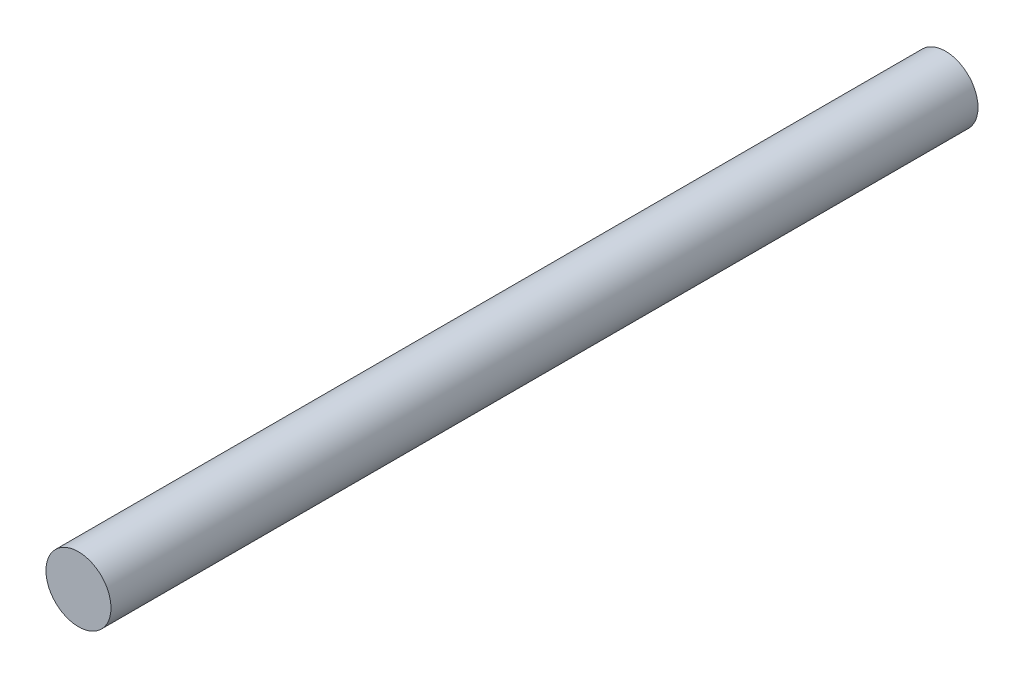
ISO-10303-21;
HEADER;
FILE_DESCRIPTION(('STEP AP214'),'2;1');
FILE_NAME('part.step','',(''),(''),'','','');
FILE_SCHEMA(('AUTOMOTIVE_DESIGN { 1 0 10303 214 1 1 1 1 }'));
ENDSEC;
DATA;
#1=APPLICATION_CONTEXT('core data for automotive mechanical design processes');
#2=APPLICATION_PROTOCOL_DEFINITION('international standard','automotive_design',2000,#1);
#3=PRODUCT_CONTEXT('',#1,'mechanical');
#4=PRODUCT('Part','Part','',(#3));
#5=PRODUCT_RELATED_PRODUCT_CATEGORY('part','',(#4));
#6=PRODUCT_DEFINITION_FORMATION('','',#4);
#7=PRODUCT_DEFINITION_CONTEXT('part definition',#1,'design');
#8=PRODUCT_DEFINITION('design','',#6,#7);
#9=PRODUCT_DEFINITION_SHAPE('','',#8);
#10=(LENGTH_UNIT() NAMED_UNIT(*) SI_UNIT(.MILLI.,.METRE.));
#11=(NAMED_UNIT(*) PLANE_ANGLE_UNIT() SI_UNIT($,.RADIAN.));
#12=(NAMED_UNIT(*) SI_UNIT($,.STERADIAN.) SOLID_ANGLE_UNIT());
#13=UNCERTAINTY_MEASURE_WITH_UNIT(LENGTH_MEASURE(1.E-05),#10,'distance_accuracy_value','');
#14=(GEOMETRIC_REPRESENTATION_CONTEXT(3) GLOBAL_UNCERTAINTY_ASSIGNED_CONTEXT((#13)) GLOBAL_UNIT_ASSIGNED_CONTEXT((#10,
#11,#12)) REPRESENTATION_CONTEXT('',''));
#15=CARTESIAN_POINT('',(0.,0.,0.));
#16=DIRECTION('',(0.,0.,1.));
#17=DIRECTION('',(1.,0.,0.));
#18=AXIS2_PLACEMENT_3D('',#15,#16,#17);
#19=CARTESIAN_POINT('',(0.,0.,127.));
#20=DIRECTION('',(0.,0.,-1.));
#21=DIRECTION('',(-1.,0.,0.));
#22=AXIS2_PLACEMENT_3D('',#19,#20,#21);
#23=CYLINDRICAL_SURFACE('',#22,9.525);
#24=CARTESIAN_POINT('',(0.,0.,127.));
#25=DIRECTION('',(0.,0.,1.));
#26=DIRECTION('',(1.,0.,0.));
#27=AXIS2_PLACEMENT_3D('',#24,#25,#26);
#28=CIRCLE('',#27,9.525);
#29=CARTESIAN_POINT('',(9.525,0.,127.));
#30=VERTEX_POINT('',#29);
#31=EDGE_CURVE('E10',#30,#30,#28,.T.);
#32=ORIENTED_EDGE('',*,*,#31,.F.);
#33=EDGE_LOOP('',(#32));
#34=FACE_BOUND('',#33,.T.);
#35=CARTESIAN_POINT('',(0.,0.,-127.));
#36=DIRECTION('',(0.,0.,1.));
#37=DIRECTION('',(1.,0.,0.));
#38=AXIS2_PLACEMENT_3D('',#35,#36,#37);
#39=CIRCLE('',#38,9.525);
#40=CARTESIAN_POINT('',(9.525,0.,-127.));
#41=VERTEX_POINT('',#40);
#42=EDGE_CURVE('E34',#41,#41,#39,.T.);
#43=ORIENTED_EDGE('',*,*,#42,.T.);
#44=EDGE_LOOP('',(#43));
#45=FACE_BOUND('',#44,.T.);
#46=ADVANCED_FACE('F31',(#34,#45),#23,.T.);
#47=CARTESIAN_POINT('',(0.,0.,127.));
#48=DIRECTION('',(0.,0.,1.));
#49=DIRECTION('',(1.,0.,0.));
#50=AXIS2_PLACEMENT_3D('',#47,#48,#49);
#51=PLANE('',#50);
#52=ORIENTED_EDGE('',*,*,#31,.T.);
#53=EDGE_LOOP('',(#52));
#54=FACE_BOUND('',#53,.T.);
#55=ADVANCED_FACE('F46',(#54),#51,.T.);
#56=CARTESIAN_POINT('',(0.,0.,-127.));
#57=DIRECTION('',(0.,0.,1.));
#58=DIRECTION('',(1.,0.,0.));
#59=AXIS2_PLACEMENT_3D('',#56,#57,#58);
#60=PLANE('',#59);
#61=ORIENTED_EDGE('',*,*,#42,.F.);
#62=EDGE_LOOP('',(#61));
#63=FACE_BOUND('',#62,.T.);
#64=ADVANCED_FACE('F44',(#63),#60,.F.);
#65=CLOSED_SHELL('',(#46,#55,#64));
#66=MANIFOLD_SOLID_BREP('B2',#65);
#67=ADVANCED_BREP_SHAPE_REPRESENTATION('',(#18,#66),#14);
#68=SHAPE_DEFINITION_REPRESENTATION(#9,#67);
ENDSEC;
END-ISO-10303-21;
